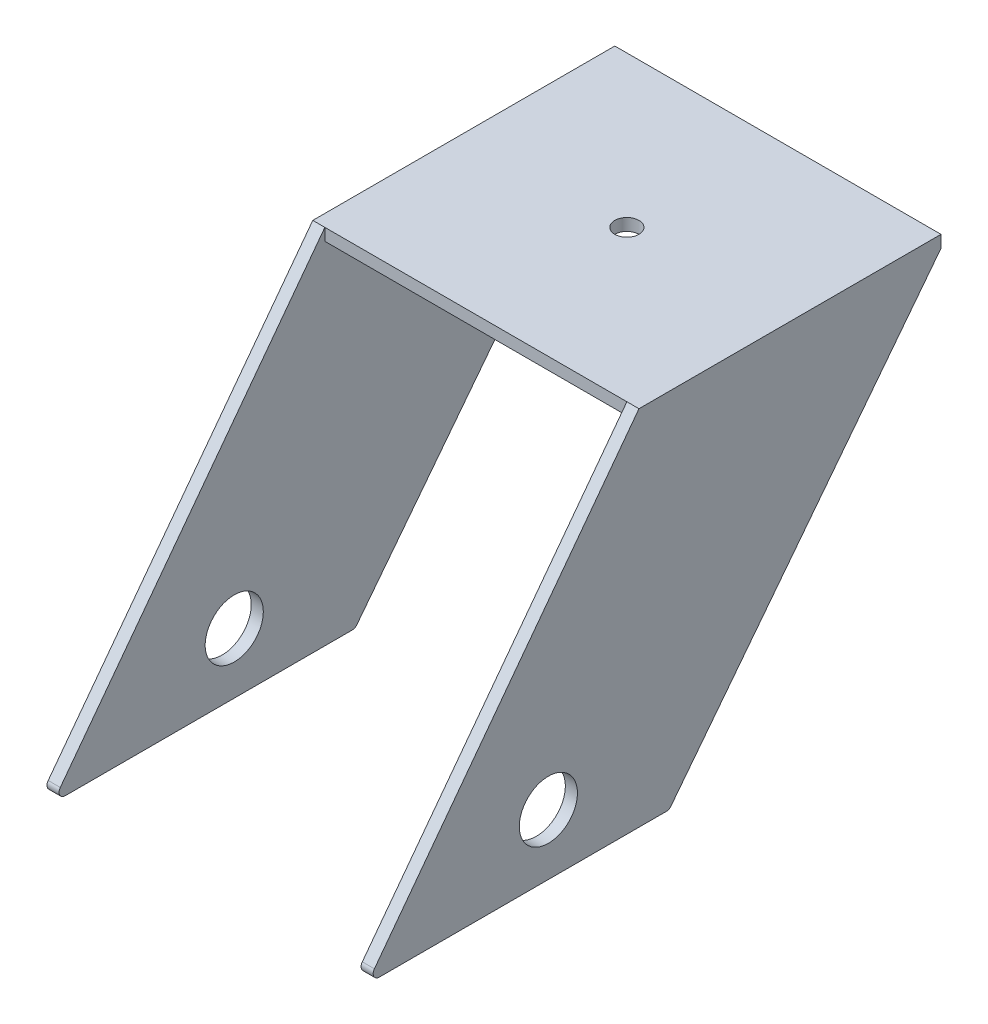
ISO-10303-21;
HEADER;
FILE_DESCRIPTION(('STEP AP214'),'2;1');
FILE_NAME('part.step','',(''),(''),'','','');
FILE_SCHEMA(('AUTOMOTIVE_DESIGN { 1 0 10303 214 1 1 1 1 }'));
ENDSEC;
DATA;
#1=APPLICATION_CONTEXT('core data for automotive mechanical design processes');
#2=APPLICATION_PROTOCOL_DEFINITION('international standard','automotive_design',2000,#1);
#3=PRODUCT_CONTEXT('',#1,'mechanical');
#4=PRODUCT('Part','Part','',(#3));
#5=PRODUCT_RELATED_PRODUCT_CATEGORY('part','',(#4));
#6=PRODUCT_DEFINITION_FORMATION('','',#4);
#7=PRODUCT_DEFINITION_CONTEXT('part definition',#1,'design');
#8=PRODUCT_DEFINITION('design','',#6,#7);
#9=PRODUCT_DEFINITION_SHAPE('','',#8);
#10=(LENGTH_UNIT() NAMED_UNIT(*) SI_UNIT(.MILLI.,.METRE.));
#11=(NAMED_UNIT(*) PLANE_ANGLE_UNIT() SI_UNIT($,.RADIAN.));
#12=(NAMED_UNIT(*) SI_UNIT($,.STERADIAN.) SOLID_ANGLE_UNIT());
#13=UNCERTAINTY_MEASURE_WITH_UNIT(LENGTH_MEASURE(1.E-05),#10,'distance_accuracy_value','');
#14=(GEOMETRIC_REPRESENTATION_CONTEXT(3) GLOBAL_UNCERTAINTY_ASSIGNED_CONTEXT((#13)) GLOBAL_UNIT_ASSIGNED_CONTEXT((#10,
#11,#12)) REPRESENTATION_CONTEXT('',''));
#15=CARTESIAN_POINT('',(0.,0.,0.));
#16=DIRECTION('',(0.,0.,1.));
#17=DIRECTION('',(1.,0.,0.));
#18=AXIS2_PLACEMENT_3D('',#15,#16,#17);
#19=CARTESIAN_POINT('',(-25.,2.,-25.));
#20=DIRECTION('',(1.,0.,0.));
#21=DIRECTION('',(0.,0.,-1.));
#22=AXIS2_PLACEMENT_3D('',#19,#20,#21);
#23=PLANE('',#22);
#24=DIRECTION('',(0.,-0.790219844436552,0.612823463534705));
#25=VECTOR('',#24,1.);
#26=CARTESIAN_POINT('',(-25.,-58.0000000000004,20.0000000000002));
#27=LINE('',#26,#25);
#28=CARTESIAN_POINT('',(-25.,0.0263242444060938,-25.));
#29=VERTEX_POINT('',#28);
#30=CARTESIAN_POINT('',(-25.,0.,-24.979585282823));
#31=VERTEX_POINT('',#30);
#32=EDGE_CURVE('E213',#29,#31,#27,.T.);
#33=ORIENTED_EDGE('',*,*,#32,.F.);
#34=DIRECTION('',(0.,-1.,0.));
#35=VECTOR('',#34,1.);
#36=CARTESIAN_POINT('',(-25.,2.,-25.));
#37=LINE('',#36,#35);
#38=CARTESIAN_POINT('',(-25.,0.,-25.));
#39=VERTEX_POINT('',#38);
#40=EDGE_CURVE('E243',#29,#39,#37,.T.);
#41=ORIENTED_EDGE('',*,*,#40,.T.);
#42=DIRECTION('',(0.,0.,1.));
#43=VECTOR('',#42,1.);
#44=CARTESIAN_POINT('',(-25.,0.,-25.));
#45=LINE('',#44,#43);
#46=EDGE_CURVE('E244',#39,#31,#45,.T.);
#47=ORIENTED_EDGE('',*,*,#46,.T.);
#48=EDGE_LOOP('',(#33,#41,#47));
#49=FACE_BOUND('',#48,.T.);
#50=ADVANCED_FACE('F39',(#49),#23,.F.);
#51=CARTESIAN_POINT('',(0.,2.,0.));
#52=DIRECTION('',(0.,1.,0.));
#53=DIRECTION('',(0.,0.,1.));
#54=AXIS2_PLACEMENT_3D('',#51,#52,#53);
#55=PLANE('',#54);
#56=DIRECTION('',(-1.,0.,0.));
#57=VECTOR('',#56,1.);
#58=CARTESIAN_POINT('',(-25.,2.,-25.));
#59=LINE('',#58,#57);
#60=CARTESIAN_POINT('',(27.,2.,-25.));
#61=VERTEX_POINT('',#60);
#62=CARTESIAN_POINT('',(-27.,1.99999999999999,-25.));
#63=VERTEX_POINT('',#62);
#64=EDGE_CURVE('E239',#61,#63,#59,.T.);
#65=ORIENTED_EDGE('',*,*,#64,.T.);
#66=DIRECTION('',(0.,0.,-1.));
#67=VECTOR('',#66,1.);
#68=CARTESIAN_POINT('',(-27.,2.,25.));
#69=LINE('',#68,#67);
#70=CARTESIAN_POINT('',(-27.,2.,25.));
#71=VERTEX_POINT('',#70);
#72=EDGE_CURVE('E205',#71,#63,#69,.T.);
#73=ORIENTED_EDGE('',*,*,#72,.F.);
#74=DIRECTION('',(1.,0.,0.));
#75=VECTOR('',#74,1.);
#76=CARTESIAN_POINT('',(-27.,2.,25.));
#77=LINE('',#76,#75);
#78=CARTESIAN_POINT('',(-25.,2.,25.));
#79=VERTEX_POINT('',#78);
#80=EDGE_CURVE('E225',#71,#79,#77,.T.);
#81=ORIENTED_EDGE('',*,*,#80,.T.);
#82=DIRECTION('',(1.,0.,0.));
#83=VECTOR('',#82,1.);
#84=CARTESIAN_POINT('',(-25.,2.,25.));
#85=LINE('',#84,#83);
#86=CARTESIAN_POINT('',(25.,2.,25.));
#87=VERTEX_POINT('',#86);
#88=EDGE_CURVE('E175',#79,#87,#85,.T.);
#89=ORIENTED_EDGE('',*,*,#88,.T.);
#90=DIRECTION('',(-1.,0.,0.));
#91=VECTOR('',#90,1.);
#92=CARTESIAN_POINT('',(27.,2.,25.));
#93=LINE('',#92,#91);
#94=CARTESIAN_POINT('',(27.,2.,25.));
#95=VERTEX_POINT('',#94);
#96=EDGE_CURVE('E152',#95,#87,#93,.T.);
#97=ORIENTED_EDGE('',*,*,#96,.F.);
#98=DIRECTION('',(0.,0.,1.));
#99=VECTOR('',#98,1.);
#100=CARTESIAN_POINT('',(27.,2.,-25.));
#101=LINE('',#100,#99);
#102=EDGE_CURVE('E159',#61,#95,#101,.T.);
#103=ORIENTED_EDGE('',*,*,#102,.F.);
#104=EDGE_LOOP('',(#65,#73,#81,#89,#97,#103));
#105=FACE_BOUND('',#104,.T.);
#106=CARTESIAN_POINT('',(0.,2.,0.));
#107=DIRECTION('',(0.,1.,0.));
#108=DIRECTION('',(0.,0.,1.));
#109=AXIS2_PLACEMENT_3D('',#106,#107,#108);
#110=CIRCLE('',#109,2.);
#111=CARTESIAN_POINT('',(0.,2.,2.));
#112=VERTEX_POINT('',#111);
#113=EDGE_CURVE('E229',#112,#112,#110,.T.);
#114=ORIENTED_EDGE('',*,*,#113,.F.);
#115=EDGE_LOOP('',(#114));
#116=FACE_BOUND('',#115,.T.);
#117=ADVANCED_FACE('F171',(#105,#116),#55,.T.);
#118=CARTESIAN_POINT('',(0.,0.,0.));
#119=DIRECTION('',(0.,1.,0.));
#120=DIRECTION('',(0.,0.,1.));
#121=AXIS2_PLACEMENT_3D('',#118,#119,#120);
#122=PLANE('',#121);
#123=ORIENTED_EDGE('',*,*,#46,.F.);
#124=DIRECTION('',(-1.,0.,0.));
#125=VECTOR('',#124,1.);
#126=CARTESIAN_POINT('',(-25.,0.,-25.));
#127=LINE('',#126,#125);
#128=CARTESIAN_POINT('',(25.,0.,-25.));
#129=VERTEX_POINT('',#128);
#130=EDGE_CURVE('E240',#129,#39,#127,.T.);
#131=ORIENTED_EDGE('',*,*,#130,.F.);
#132=DIRECTION('',(0.,0.,-1.));
#133=VECTOR('',#132,1.);
#134=CARTESIAN_POINT('',(25.,0.,-25.));
#135=LINE('',#134,#133);
#136=CARTESIAN_POINT('',(25.,0.,25.));
#137=VERTEX_POINT('',#136);
#138=EDGE_CURVE('E251',#137,#129,#135,.T.);
#139=ORIENTED_EDGE('',*,*,#138,.F.);
#140=DIRECTION('',(1.,0.,0.));
#141=VECTOR('',#140,1.);
#142=CARTESIAN_POINT('',(-25.,0.,25.));
#143=LINE('',#142,#141);
#144=CARTESIAN_POINT('',(-25.,0.,25.));
#145=VERTEX_POINT('',#144);
#146=EDGE_CURVE('E247',#145,#137,#143,.T.);
#147=ORIENTED_EDGE('',*,*,#146,.F.);
#148=EDGE_CURVE('E233',#31,#145,#45,.T.);
#149=ORIENTED_EDGE('',*,*,#148,.F.);
#150=EDGE_LOOP('',(#123,#131,#139,#147,#149));
#151=FACE_BOUND('',#150,.T.);
#152=CARTESIAN_POINT('',(0.,0.,0.));
#153=DIRECTION('',(0.,1.,0.));
#154=DIRECTION('',(0.,0.,1.));
#155=AXIS2_PLACEMENT_3D('',#152,#153,#154);
#156=CIRCLE('',#155,2.);
#157=CARTESIAN_POINT('',(0.,0.,2.));
#158=VERTEX_POINT('',#157);
#159=EDGE_CURVE('E228',#158,#158,#156,.T.);
#160=ORIENTED_EDGE('',*,*,#159,.T.);
#161=EDGE_LOOP('',(#160));
#162=FACE_BOUND('',#161,.T.);
#163=ADVANCED_FACE('F356',(#151,#162),#122,.F.);
#164=CARTESIAN_POINT('',(-25.,2.,25.));
#165=DIRECTION('',(0.,0.,-1.));
#166=DIRECTION('',(-1.,0.,0.));
#167=AXIS2_PLACEMENT_3D('',#164,#165,#166);
#168=PLANE('',#167);
#169=ORIENTED_EDGE('',*,*,#146,.T.);
#170=DIRECTION('',(0.,-1.,0.));
#171=VECTOR('',#170,1.);
#172=CARTESIAN_POINT('',(25.,2.,25.));
#173=LINE('',#172,#171);
#174=EDGE_CURVE('E260',#87,#137,#173,.T.);
#175=ORIENTED_EDGE('',*,*,#174,.F.);
#176=ORIENTED_EDGE('',*,*,#88,.F.);
#177=DIRECTION('',(0.,-1.,0.));
#178=VECTOR('',#177,1.);
#179=CARTESIAN_POINT('',(-25.,2.,25.));
#180=LINE('',#179,#178);
#181=EDGE_CURVE('E264',#79,#145,#180,.T.);
#182=ORIENTED_EDGE('',*,*,#181,.T.);
#183=EDGE_LOOP('',(#169,#175,#176,#182));
#184=FACE_BOUND('',#183,.T.);
#185=ADVANCED_FACE('F360',(#184),#168,.F.);
#186=CARTESIAN_POINT('',(-25.,2.,-25.));
#187=DIRECTION('',(0.,0.,1.));
#188=DIRECTION('',(1.,0.,0.));
#189=AXIS2_PLACEMENT_3D('',#186,#187,#188);
#190=PLANE('',#189);
#191=ORIENTED_EDGE('',*,*,#130,.T.);
#192=ORIENTED_EDGE('',*,*,#40,.F.);
#193=DIRECTION('',(1.,0.,0.));
#194=VECTOR('',#193,1.);
#195=CARTESIAN_POINT('',(-27.,0.0263242444060729,-25.));
#196=LINE('',#195,#194);
#197=CARTESIAN_POINT('',(-27.,0.0263242444060729,-25.));
#198=VERTEX_POINT('',#197);
#199=EDGE_CURVE('E212',#198,#29,#196,.T.);
#200=ORIENTED_EDGE('',*,*,#199,.F.);
#201=DIRECTION('',(0.,-1.,0.));
#202=VECTOR('',#201,1.);
#203=CARTESIAN_POINT('',(-27.,0.0263242444060729,-25.));
#204=LINE('',#203,#202);
#205=EDGE_CURVE('E209',#63,#198,#204,.T.);
#206=ORIENTED_EDGE('',*,*,#205,.F.);
#207=ORIENTED_EDGE('',*,*,#64,.F.);
#208=DIRECTION('',(0.,1.,0.));
#209=VECTOR('',#208,1.);
#210=CARTESIAN_POINT('',(27.,0.,-25.));
#211=LINE('',#210,#209);
#212=CARTESIAN_POINT('',(27.,0.,-25.));
#213=VERTEX_POINT('',#212);
#214=EDGE_CURVE('E166',#213,#61,#211,.T.);
#215=ORIENTED_EDGE('',*,*,#214,.F.);
#216=DIRECTION('',(-1.,0.,0.));
#217=VECTOR('',#216,1.);
#218=CARTESIAN_POINT('',(27.,0.,-25.));
#219=LINE('',#218,#217);
#220=EDGE_CURVE('E179',#213,#129,#219,.T.);
#221=ORIENTED_EDGE('',*,*,#220,.T.);
#222=EDGE_LOOP('',(#191,#192,#200,#206,#207,#215,#221));
#223=FACE_BOUND('',#222,.T.);
#224=ADVANCED_FACE('F344',(#223),#190,.F.);
#225=CARTESIAN_POINT('',(0.,2.,0.));
#226=DIRECTION('',(0.,-1.,0.));
#227=DIRECTION('',(0.,0.,-1.));
#228=AXIS2_PLACEMENT_3D('',#225,#226,#227);
#229=CYLINDRICAL_SURFACE('',#228,2.);
#230=ORIENTED_EDGE('',*,*,#113,.T.);
#231=EDGE_LOOP('',(#230));
#232=FACE_BOUND('',#231,.T.);
#233=ORIENTED_EDGE('',*,*,#159,.F.);
#234=EDGE_LOOP('',(#233));
#235=FACE_BOUND('',#234,.T.);
#236=ADVANCED_FACE('F335',(#232,#235),#229,.F.);
#237=CARTESIAN_POINT('',(-25.,0.,0.));
#238=DIRECTION('',(-1.,0.,0.));
#239=DIRECTION('',(0.,0.,1.));
#240=AXIS2_PLACEMENT_3D('',#237,#238,#239);
#241=PLANE('',#240);
#242=CARTESIAN_POINT('',(-25.,-48.,40.));
#243=DIRECTION('',(-1.,0.,0.));
#244=DIRECTION('',(0.,0.,-1.));
#245=AXIS2_PLACEMENT_3D('',#242,#243,#244);
#246=CIRCLE('',#245,4.81283750389461);
#247=CARTESIAN_POINT('',(-25.,-48.,35.1871624961054));
#248=VERTEX_POINT('',#247);
#249=EDGE_CURVE('E178',#248,#248,#246,.T.);
#250=ORIENTED_EDGE('',*,*,#249,.T.);
#251=EDGE_LOOP('',(#250));
#252=FACE_BOUND('',#251,.T.);
#253=DIRECTION('',(0.,0.800000000000001,-0.599999999999999));
#254=VECTOR('',#253,1.);
#255=CARTESIAN_POINT('',(-25.,2.,25.));
#256=LINE('',#255,#254);
#257=CARTESIAN_POINT('',(-25.,-56.3999999999996,68.7999999999996));
#258=VERTEX_POINT('',#257);
#259=EDGE_CURVE('E199',#258,#79,#256,.T.);
#260=ORIENTED_EDGE('',*,*,#259,.F.);
#261=CARTESIAN_POINT('',(-25.,-56.9999999999996,67.9999999999996));
#262=DIRECTION('',(-1.,0.,0.));
#263=DIRECTION('',(0.,0.,1.));
#264=AXIS2_PLACEMENT_3D('',#261,#262,#263);
#265=CIRCLE('',#264,1.);
#266=CARTESIAN_POINT('',(-25.,-57.9999999999996,67.9999999999996));
#267=VERTEX_POINT('',#266);
#268=EDGE_CURVE('E62',#258,#267,#265,.F.);
#269=ORIENTED_EDGE('',*,*,#268,.T.);
#270=DIRECTION('',(0.,0.,1.));
#271=VECTOR('',#270,1.);
#272=CARTESIAN_POINT('',(-25.,-57.9999999999996,69.9999999999996));
#273=LINE('',#272,#271);
#274=CARTESIAN_POINT('',(-25.,-58.0000000000004,20.4899605333773));
#275=VERTEX_POINT('',#274);
#276=EDGE_CURVE('E217',#275,#267,#273,.T.);
#277=ORIENTED_EDGE('',*,*,#276,.F.);
#278=CARTESIAN_POINT('',(-25.,-57.0000000000004,20.4899605333773));
#279=DIRECTION('',(-1.,0.,0.));
#280=DIRECTION('',(0.,0.,1.));
#281=AXIS2_PLACEMENT_3D('',#278,#279,#280);
#282=CIRCLE('',#281,1.);
#283=CARTESIAN_POINT('',(-25.,-57.6128234635351,19.6997406889408));
#284=VERTEX_POINT('',#283);
#285=EDGE_CURVE('E287',#275,#284,#282,.F.);
#286=ORIENTED_EDGE('',*,*,#285,.T.);
#287=EDGE_CURVE('E192',#31,#284,#27,.T.);
#288=ORIENTED_EDGE('',*,*,#287,.F.);
#289=ORIENTED_EDGE('',*,*,#148,.T.);
#290=ORIENTED_EDGE('',*,*,#181,.F.);
#291=EDGE_LOOP('',(#260,#269,#277,#286,#288,#289,#290));
#292=FACE_BOUND('',#291,.T.);
#293=ADVANCED_FACE('F332',(#252,#292),#241,.F.);
#294=CARTESIAN_POINT('',(-27.,0.,0.));
#295=DIRECTION('',(-1.,0.,0.));
#296=DIRECTION('',(0.,0.,1.));
#297=AXIS2_PLACEMENT_3D('',#294,#295,#296);
#298=PLANE('',#297);
#299=DIRECTION('',(0.,0.,1.));
#300=VECTOR('',#299,1.);
#301=CARTESIAN_POINT('',(-27.,-57.9999999999996,69.9999999999996));
#302=LINE('',#301,#300);
#303=CARTESIAN_POINT('',(-27.,-58.0000000000004,20.4899605333773));
#304=VERTEX_POINT('',#303);
#305=CARTESIAN_POINT('',(-27.,-57.9999999999996,67.9999999999996));
#306=VERTEX_POINT('',#305);
#307=EDGE_CURVE('E198',#304,#306,#302,.T.);
#308=ORIENTED_EDGE('',*,*,#307,.T.);
#309=CARTESIAN_POINT('',(-27.,-56.9999999999996,67.9999999999996));
#310=DIRECTION('',(-1.,0.,0.));
#311=DIRECTION('',(0.,0.,1.));
#312=AXIS2_PLACEMENT_3D('',#309,#310,#311);
#313=CIRCLE('',#312,1.);
#314=CARTESIAN_POINT('',(-27.,-56.3999999999996,68.7999999999996));
#315=VERTEX_POINT('',#314);
#316=EDGE_CURVE('E11',#306,#315,#313,.T.);
#317=ORIENTED_EDGE('',*,*,#316,.T.);
#318=DIRECTION('',(0.,0.800000000000001,-0.599999999999999));
#319=VECTOR('',#318,1.);
#320=CARTESIAN_POINT('',(-27.,2.,25.));
#321=LINE('',#320,#319);
#322=EDGE_CURVE('E202',#315,#71,#321,.T.);
#323=ORIENTED_EDGE('',*,*,#322,.T.);
#324=ORIENTED_EDGE('',*,*,#72,.T.);
#325=ORIENTED_EDGE('',*,*,#205,.T.);
#326=DIRECTION('',(0.,-0.790219844436552,0.612823463534705));
#327=VECTOR('',#326,1.);
#328=CARTESIAN_POINT('',(-27.,-58.0000000000004,20.0000000000002));
#329=LINE('',#328,#327);
#330=CARTESIAN_POINT('',(-27.,-57.6128234635351,19.6997406889408));
#331=VERTEX_POINT('',#330);
#332=EDGE_CURVE('E194',#198,#331,#329,.T.);
#333=ORIENTED_EDGE('',*,*,#332,.T.);
#334=CARTESIAN_POINT('',(-27.,-57.0000000000004,20.4899605333773));
#335=DIRECTION('',(-1.,0.,0.));
#336=DIRECTION('',(0.,0.,1.));
#337=AXIS2_PLACEMENT_3D('',#334,#335,#336);
#338=CIRCLE('',#337,1.);
#339=EDGE_CURVE('E293',#331,#304,#338,.T.);
#340=ORIENTED_EDGE('',*,*,#339,.T.);
#341=EDGE_LOOP('',(#308,#317,#323,#324,#325,#333,#340));
#342=FACE_BOUND('',#341,.T.);
#343=CARTESIAN_POINT('',(-27.,-48.,40.));
#344=DIRECTION('',(-1.,0.,0.));
#345=DIRECTION('',(0.,0.,-1.));
#346=AXIS2_PLACEMENT_3D('',#343,#344,#345);
#347=CIRCLE('',#346,4.81283750389461);
#348=CARTESIAN_POINT('',(-27.,-48.,35.1871624961054));
#349=VERTEX_POINT('',#348);
#350=EDGE_CURVE('E184',#349,#349,#347,.T.);
#351=ORIENTED_EDGE('',*,*,#350,.F.);
#352=EDGE_LOOP('',(#351));
#353=FACE_BOUND('',#352,.T.);
#354=ADVANCED_FACE('F328',(#342,#353),#298,.T.);
#355=CARTESIAN_POINT('',(-27.,-58.0000000000004,20.0000000000002));
#356=DIRECTION('',(0.,0.612823463534705,0.790219844436552));
#357=DIRECTION('',(0.,-0.790219844436552,0.612823463534705));
#358=AXIS2_PLACEMENT_3D('',#355,#356,#357);
#359=PLANE('',#358);
#360=ORIENTED_EDGE('',*,*,#287,.T.);
#361=DIRECTION('',(1.,0.,0.));
#362=VECTOR('',#361,1.);
#363=CARTESIAN_POINT('',(-27.,-57.6128234635351,19.6997406889408));
#364=LINE('',#363,#362);
#365=EDGE_CURVE('E290',#284,#331,#364,.F.);
#366=ORIENTED_EDGE('',*,*,#365,.T.);
#367=ORIENTED_EDGE('',*,*,#332,.F.);
#368=ORIENTED_EDGE('',*,*,#199,.T.);
#369=ORIENTED_EDGE('',*,*,#32,.T.);
#370=EDGE_LOOP('',(#360,#366,#367,#368,#369));
#371=FACE_BOUND('',#370,.T.);
#372=ADVANCED_FACE('F321',(#371),#359,.F.);
#373=CARTESIAN_POINT('',(-27.,-57.9999999999996,69.9999999999996));
#374=DIRECTION('',(0.,1.,0.));
#375=DIRECTION('',(0.,0.,1.));
#376=AXIS2_PLACEMENT_3D('',#373,#374,#375);
#377=PLANE('',#376);
#378=ORIENTED_EDGE('',*,*,#276,.T.);
#379=DIRECTION('',(1.,0.,0.));
#380=VECTOR('',#379,1.);
#381=CARTESIAN_POINT('',(-27.,-57.9999999999996,67.9999999999996));
#382=LINE('',#381,#380);
#383=EDGE_CURVE('E48',#267,#306,#382,.F.);
#384=ORIENTED_EDGE('',*,*,#383,.T.);
#385=ORIENTED_EDGE('',*,*,#307,.F.);
#386=DIRECTION('',(1.,0.,0.));
#387=VECTOR('',#386,1.);
#388=CARTESIAN_POINT('',(-27.,-58.0000000000004,20.4899605333773));
#389=LINE('',#388,#387);
#390=EDGE_CURVE('E283',#304,#275,#389,.T.);
#391=ORIENTED_EDGE('',*,*,#390,.T.);
#392=EDGE_LOOP('',(#378,#384,#385,#391));
#393=FACE_BOUND('',#392,.T.);
#394=ADVANCED_FACE('F331',(#393),#377,.F.);
#395=CARTESIAN_POINT('',(-27.,2.,25.));
#396=DIRECTION('',(0.,-0.599999999999999,-0.800000000000001));
#397=DIRECTION('',(0.,0.800000000000001,-0.599999999999999));
#398=AXIS2_PLACEMENT_3D('',#395,#396,#397);
#399=PLANE('',#398);
#400=ORIENTED_EDGE('',*,*,#322,.F.);
#401=DIRECTION('',(1.,0.,0.));
#402=VECTOR('',#401,1.);
#403=CARTESIAN_POINT('',(-27.,-56.3999999999996,68.7999999999996));
#404=LINE('',#403,#402);
#405=EDGE_CURVE('E308',#315,#258,#404,.T.);
#406=ORIENTED_EDGE('',*,*,#405,.T.);
#407=ORIENTED_EDGE('',*,*,#259,.T.);
#408=ORIENTED_EDGE('',*,*,#80,.F.);
#409=EDGE_LOOP('',(#400,#406,#407,#408));
#410=FACE_BOUND('',#409,.T.);
#411=ADVANCED_FACE('F421',(#410),#399,.F.);
#412=CARTESIAN_POINT('',(-27.,-48.,40.));
#413=DIRECTION('',(1.,0.,0.));
#414=DIRECTION('',(0.,0.,-1.));
#415=AXIS2_PLACEMENT_3D('',#412,#413,#414);
#416=CYLINDRICAL_SURFACE('',#415,4.81283750389461);
#417=ORIENTED_EDGE('',*,*,#350,.T.);
#418=EDGE_LOOP('',(#417));
#419=FACE_BOUND('',#418,.T.);
#420=ORIENTED_EDGE('',*,*,#249,.F.);
#421=EDGE_LOOP('',(#420));
#422=FACE_BOUND('',#421,.T.);
#423=ADVANCED_FACE('F437',(#419,#422),#416,.F.);
#424=CARTESIAN_POINT('',(27.,0.,0.));
#425=DIRECTION('',(-1.,0.,0.));
#426=DIRECTION('',(0.,0.,1.));
#427=AXIS2_PLACEMENT_3D('',#424,#425,#426);
#428=PLANE('',#427);
#429=DIRECTION('',(0.,-0.8,0.6));
#430=VECTOR('',#429,1.);
#431=CARTESIAN_POINT('',(27.,2.,25.));
#432=LINE('',#431,#430);
#433=CARTESIAN_POINT('',(27.,-56.4,68.8));
#434=VERTEX_POINT('',#433);
#435=EDGE_CURVE('E147',#95,#434,#432,.T.);
#436=ORIENTED_EDGE('',*,*,#435,.T.);
#437=CARTESIAN_POINT('',(27.,-57.,68.));
#438=DIRECTION('',(-1.,0.,0.));
#439=DIRECTION('',(0.,0.,1.));
#440=AXIS2_PLACEMENT_3D('',#437,#438,#439);
#441=CIRCLE('',#440,1.);
#442=CARTESIAN_POINT('',(27.,-58.,68.));
#443=VERTEX_POINT('',#442);
#444=EDGE_CURVE('E305',#434,#443,#441,.F.);
#445=ORIENTED_EDGE('',*,*,#444,.T.);
#446=DIRECTION('',(0.,0.,-1.));
#447=VECTOR('',#446,1.);
#448=CARTESIAN_POINT('',(27.,-58.,70.));
#449=LINE('',#448,#447);
#450=CARTESIAN_POINT('',(27.,-58.,20.4898242863609));
#451=VERTEX_POINT('',#450);
#452=EDGE_CURVE('E158',#443,#451,#449,.T.);
#453=ORIENTED_EDGE('',*,*,#452,.T.);
#454=CARTESIAN_POINT('',(27.,-57.,20.4898242863609));
#455=DIRECTION('',(-1.,0.,0.));
#456=DIRECTION('',(0.,0.,1.));
#457=AXIS2_PLACEMENT_3D('',#454,#455,#456);
#458=CIRCLE('',#457,1.);
#459=CARTESIAN_POINT('',(27.,-57.6129971028766,19.6997391315422));
#460=VERTEX_POINT('',#459);
#461=EDGE_CURVE('E280',#451,#460,#458,.F.);
#462=ORIENTED_EDGE('',*,*,#461,.T.);
#463=DIRECTION('',(0.,0.790085154818713,-0.612997102876588));
#464=VECTOR('',#463,1.);
#465=CARTESIAN_POINT('',(27.,-58.,20.));
#466=LINE('',#465,#464);
#467=EDGE_CURVE('E383',#460,#213,#466,.T.);
#468=ORIENTED_EDGE('',*,*,#467,.T.);
#469=ORIENTED_EDGE('',*,*,#214,.T.);
#470=ORIENTED_EDGE('',*,*,#102,.T.);
#471=EDGE_LOOP('',(#436,#445,#453,#462,#468,#469,#470));
#472=FACE_BOUND('',#471,.T.);
#473=CARTESIAN_POINT('',(27.,-48.,40.));
#474=DIRECTION('',(1.,0.,0.));
#475=DIRECTION('',(0.,0.,-1.));
#476=AXIS2_PLACEMENT_3D('',#473,#474,#475);
#477=CIRCLE('',#476,4.81283750389525);
#478=CARTESIAN_POINT('',(27.,-48.,35.1871624961047));
#479=VERTEX_POINT('',#478);
#480=EDGE_CURVE('E394',#479,#479,#477,.T.);
#481=ORIENTED_EDGE('',*,*,#480,.F.);
#482=EDGE_LOOP('',(#481));
#483=FACE_BOUND('',#482,.T.);
#484=ADVANCED_FACE('F163',(#472,#483),#428,.F.);
#485=CARTESIAN_POINT('',(25.,0.,0.));
#486=DIRECTION('',(-1.,0.,0.));
#487=DIRECTION('',(0.,0.,1.));
#488=AXIS2_PLACEMENT_3D('',#485,#486,#487);
#489=PLANE('',#488);
#490=DIRECTION('',(0.,0.,-1.));
#491=VECTOR('',#490,1.);
#492=CARTESIAN_POINT('',(25.,-58.,70.));
#493=LINE('',#492,#491);
#494=CARTESIAN_POINT('',(25.,-58.,68.));
#495=VERTEX_POINT('',#494);
#496=CARTESIAN_POINT('',(25.,-58.,20.4898242863609));
#497=VERTEX_POINT('',#496);
#498=EDGE_CURVE('E393',#495,#497,#493,.T.);
#499=ORIENTED_EDGE('',*,*,#498,.F.);
#500=CARTESIAN_POINT('',(25.,-57.,68.));
#501=DIRECTION('',(-1.,0.,0.));
#502=DIRECTION('',(0.,0.,1.));
#503=AXIS2_PLACEMENT_3D('',#500,#501,#502);
#504=CIRCLE('',#503,1.);
#505=CARTESIAN_POINT('',(25.,-56.4,68.8));
#506=VERTEX_POINT('',#505);
#507=EDGE_CURVE('E300',#495,#506,#504,.T.);
#508=ORIENTED_EDGE('',*,*,#507,.T.);
#509=DIRECTION('',(0.,-0.8,0.6));
#510=VECTOR('',#509,1.);
#511=CARTESIAN_POINT('',(25.,2.,25.));
#512=LINE('',#511,#510);
#513=EDGE_CURVE('E390',#87,#506,#512,.T.);
#514=ORIENTED_EDGE('',*,*,#513,.F.);
#515=ORIENTED_EDGE('',*,*,#174,.T.);
#516=ORIENTED_EDGE('',*,*,#138,.T.);
#517=DIRECTION('',(0.,0.790085154818713,-0.612997102876588));
#518=VECTOR('',#517,1.);
#519=CARTESIAN_POINT('',(25.,-58.,20.));
#520=LINE('',#519,#518);
#521=CARTESIAN_POINT('',(25.,-57.6129971028766,19.6997391315422));
#522=VERTEX_POINT('',#521);
#523=EDGE_CURVE('E169',#522,#129,#520,.T.);
#524=ORIENTED_EDGE('',*,*,#523,.F.);
#525=CARTESIAN_POINT('',(25.,-57.,20.4898242863609));
#526=DIRECTION('',(-1.,0.,0.));
#527=DIRECTION('',(0.,0.,1.));
#528=AXIS2_PLACEMENT_3D('',#525,#526,#527);
#529=CIRCLE('',#528,1.);
#530=EDGE_CURVE('E272',#522,#497,#529,.T.);
#531=ORIENTED_EDGE('',*,*,#530,.T.);
#532=EDGE_LOOP('',(#499,#508,#514,#515,#516,#524,#531));
#533=FACE_BOUND('',#532,.T.);
#534=CARTESIAN_POINT('',(25.,-48.,40.));
#535=DIRECTION('',(1.,0.,0.));
#536=DIRECTION('',(0.,0.,-1.));
#537=AXIS2_PLACEMENT_3D('',#534,#535,#536);
#538=CIRCLE('',#537,4.81283750389525);
#539=CARTESIAN_POINT('',(25.,-48.,35.1871624961047));
#540=VERTEX_POINT('',#539);
#541=EDGE_CURVE('E465',#540,#540,#538,.T.);
#542=ORIENTED_EDGE('',*,*,#541,.T.);
#543=EDGE_LOOP('',(#542));
#544=FACE_BOUND('',#543,.T.);
#545=ADVANCED_FACE('F411',(#533,#544),#489,.T.);
#546=CARTESIAN_POINT('',(27.,2.,25.));
#547=DIRECTION('',(0.,-0.6,-0.8));
#548=DIRECTION('',(0.,0.8,-0.6));
#549=AXIS2_PLACEMENT_3D('',#546,#547,#548);
#550=PLANE('',#549);
#551=ORIENTED_EDGE('',*,*,#513,.T.);
#552=DIRECTION('',(-1.,0.,0.));
#553=VECTOR('',#552,1.);
#554=CARTESIAN_POINT('',(27.,-56.4,68.8));
#555=LINE('',#554,#553);
#556=EDGE_CURVE('E154',#506,#434,#555,.F.);
#557=ORIENTED_EDGE('',*,*,#556,.T.);
#558=ORIENTED_EDGE('',*,*,#435,.F.);
#559=ORIENTED_EDGE('',*,*,#96,.T.);
#560=EDGE_LOOP('',(#551,#557,#558,#559));
#561=FACE_BOUND('',#560,.T.);
#562=ADVANCED_FACE('F150',(#561),#550,.F.);
#563=CARTESIAN_POINT('',(27.,-58.,70.));
#564=DIRECTION('',(0.,1.,0.));
#565=DIRECTION('',(0.,0.,1.));
#566=AXIS2_PLACEMENT_3D('',#563,#564,#565);
#567=PLANE('',#566);
#568=ORIENTED_EDGE('',*,*,#452,.F.);
#569=DIRECTION('',(-1.,0.,0.));
#570=VECTOR('',#569,1.);
#571=CARTESIAN_POINT('',(27.,-58.,68.));
#572=LINE('',#571,#570);
#573=EDGE_CURVE('E296',#443,#495,#572,.T.);
#574=ORIENTED_EDGE('',*,*,#573,.T.);
#575=ORIENTED_EDGE('',*,*,#498,.T.);
#576=DIRECTION('',(-1.,0.,0.));
#577=VECTOR('',#576,1.);
#578=CARTESIAN_POINT('',(27.,-58.,20.4898242863609));
#579=LINE('',#578,#577);
#580=EDGE_CURVE('E276',#497,#451,#579,.F.);
#581=ORIENTED_EDGE('',*,*,#580,.T.);
#582=EDGE_LOOP('',(#568,#574,#575,#581));
#583=FACE_BOUND('',#582,.T.);
#584=ADVANCED_FACE('F378',(#583),#567,.F.);
#585=CARTESIAN_POINT('',(27.,-58.,20.));
#586=DIRECTION('',(0.,0.612997102876588,0.790085154818713));
#587=DIRECTION('',(0.,-0.790085154818713,0.612997102876588));
#588=AXIS2_PLACEMENT_3D('',#585,#586,#587);
#589=PLANE('',#588);
#590=ORIENTED_EDGE('',*,*,#467,.F.);
#591=DIRECTION('',(-1.,0.,0.));
#592=VECTOR('',#591,1.);
#593=CARTESIAN_POINT('',(27.,-57.6129971028766,19.6997391315422));
#594=LINE('',#593,#592);
#595=EDGE_CURVE('E268',#460,#522,#594,.T.);
#596=ORIENTED_EDGE('',*,*,#595,.T.);
#597=ORIENTED_EDGE('',*,*,#523,.T.);
#598=ORIENTED_EDGE('',*,*,#220,.F.);
#599=EDGE_LOOP('',(#590,#596,#597,#598));
#600=FACE_BOUND('',#599,.T.);
#601=ADVANCED_FACE('F402',(#600),#589,.F.);
#602=CARTESIAN_POINT('',(27.,-48.,40.));
#603=DIRECTION('',(-1.,0.,0.));
#604=DIRECTION('',(0.,0.,1.));
#605=AXIS2_PLACEMENT_3D('',#602,#603,#604);
#606=CYLINDRICAL_SURFACE('',#605,4.81283750389525);
#607=ORIENTED_EDGE('',*,*,#480,.T.);
#608=EDGE_LOOP('',(#607));
#609=FACE_BOUND('',#608,.T.);
#610=ORIENTED_EDGE('',*,*,#541,.F.);
#611=EDGE_LOOP('',(#610));
#612=FACE_BOUND('',#611,.T.);
#613=ADVANCED_FACE('F365',(#609,#612),#606,.F.);
#614=CARTESIAN_POINT('',(27.,-57.,20.4898242863609));
#615=DIRECTION('',(-1.,0.,0.));
#616=DIRECTION('',(0.,0.,1.));
#617=AXIS2_PLACEMENT_3D('',#614,#615,#616);
#618=CYLINDRICAL_SURFACE('',#617,1.);
#619=ORIENTED_EDGE('',*,*,#461,.F.);
#620=ORIENTED_EDGE('',*,*,#580,.F.);
#621=ORIENTED_EDGE('',*,*,#530,.F.);
#622=ORIENTED_EDGE('',*,*,#595,.F.);
#623=EDGE_LOOP('',(#619,#620,#621,#622));
#624=FACE_BOUND('',#623,.T.);
#625=ADVANCED_FACE('F362',(#624),#618,.T.);
#626=CARTESIAN_POINT('',(-27.,-57.0000000000004,20.4899605333773));
#627=DIRECTION('',(1.,0.,0.));
#628=DIRECTION('',(0.,0.,-1.));
#629=AXIS2_PLACEMENT_3D('',#626,#627,#628);
#630=CYLINDRICAL_SURFACE('',#629,1.);
#631=ORIENTED_EDGE('',*,*,#339,.F.);
#632=ORIENTED_EDGE('',*,*,#365,.F.);
#633=ORIENTED_EDGE('',*,*,#285,.F.);
#634=ORIENTED_EDGE('',*,*,#390,.F.);
#635=EDGE_LOOP('',(#631,#632,#633,#634));
#636=FACE_BOUND('',#635,.T.);
#637=ADVANCED_FACE('F325',(#636),#630,.T.);
#638=CARTESIAN_POINT('',(27.,-57.,68.));
#639=DIRECTION('',(-1.,0.,0.));
#640=DIRECTION('',(0.,0.,1.));
#641=AXIS2_PLACEMENT_3D('',#638,#639,#640);
#642=CYLINDRICAL_SURFACE('',#641,1.);
#643=ORIENTED_EDGE('',*,*,#444,.F.);
#644=ORIENTED_EDGE('',*,*,#556,.F.);
#645=ORIENTED_EDGE('',*,*,#507,.F.);
#646=ORIENTED_EDGE('',*,*,#573,.F.);
#647=EDGE_LOOP('',(#643,#644,#645,#646));
#648=FACE_BOUND('',#647,.T.);
#649=ADVANCED_FACE('F368',(#648),#642,.T.);
#650=CARTESIAN_POINT('',(-27.,-56.9999999999996,67.9999999999996));
#651=DIRECTION('',(1.,0.,0.));
#652=DIRECTION('',(0.,0.,-1.));
#653=AXIS2_PLACEMENT_3D('',#650,#651,#652);
#654=CYLINDRICAL_SURFACE('',#653,1.);
#655=ORIENTED_EDGE('',*,*,#316,.F.);
#656=ORIENTED_EDGE('',*,*,#383,.F.);
#657=ORIENTED_EDGE('',*,*,#268,.F.);
#658=ORIENTED_EDGE('',*,*,#405,.F.);
#659=EDGE_LOOP('',(#655,#656,#657,#658));
#660=FACE_BOUND('',#659,.T.);
#661=ADVANCED_FACE('F41',(#660),#654,.T.);
#662=CLOSED_SHELL('',(#50,#117,#163,#185,#224,#236,#293,#354,#372,#394,#411,#423,#484,#545,#562,
#584,#601,#613,#625,#637,#649,#661));
#663=MANIFOLD_SOLID_BREP('B2',#662);
#664=ADVANCED_BREP_SHAPE_REPRESENTATION('',(#18,#663),#14);
#665=SHAPE_DEFINITION_REPRESENTATION(#9,#664);
ENDSEC;
END-ISO-10303-21;
